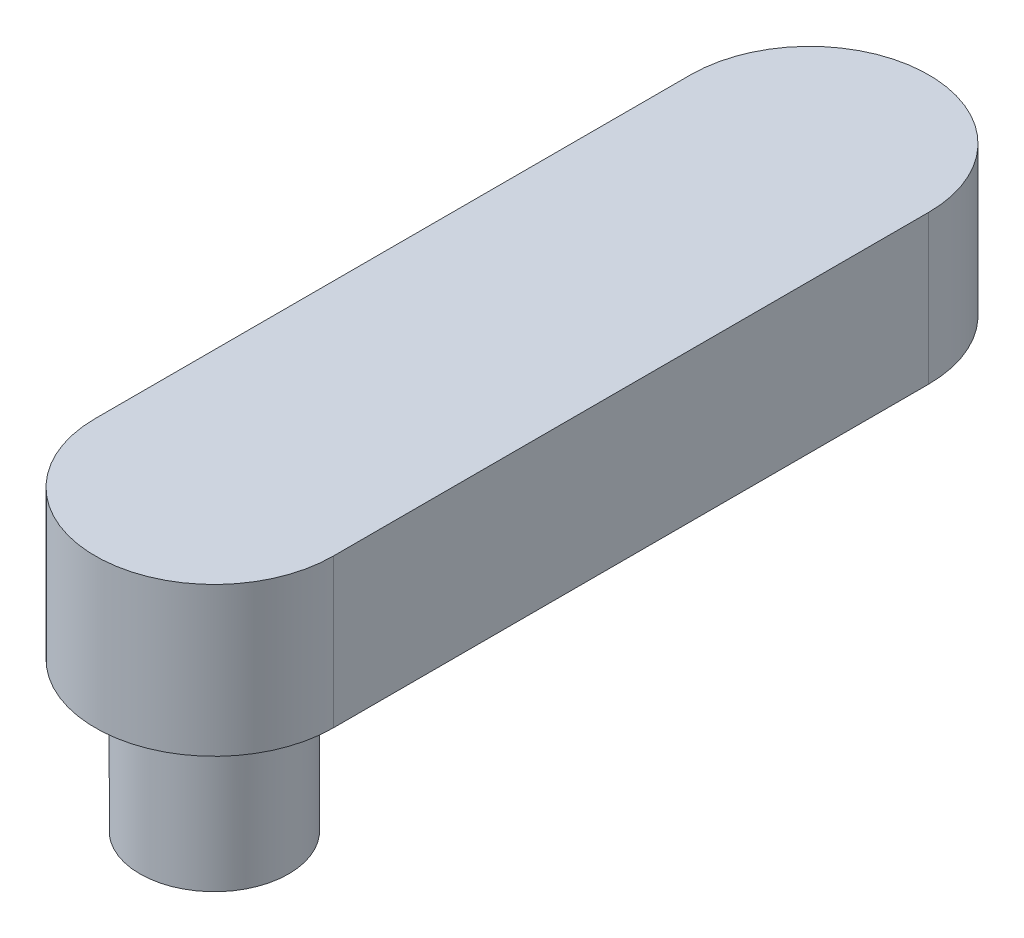
ISO-10303-21;
HEADER;
FILE_DESCRIPTION(('STEP AP214'),'2;1');
FILE_NAME('part.step','',(''),(''),'','','');
FILE_SCHEMA(('AUTOMOTIVE_DESIGN { 1 0 10303 214 1 1 1 1 }'));
ENDSEC;
DATA;
#1=APPLICATION_CONTEXT('core data for automotive mechanical design processes');
#2=APPLICATION_PROTOCOL_DEFINITION('international standard','automotive_design',2000,#1);
#3=PRODUCT_CONTEXT('',#1,'mechanical');
#4=PRODUCT('Part','Part','',(#3));
#5=PRODUCT_RELATED_PRODUCT_CATEGORY('part','',(#4));
#6=PRODUCT_DEFINITION_FORMATION('','',#4);
#7=PRODUCT_DEFINITION_CONTEXT('part definition',#1,'design');
#8=PRODUCT_DEFINITION('design','',#6,#7);
#9=PRODUCT_DEFINITION_SHAPE('','',#8);
#10=(LENGTH_UNIT() NAMED_UNIT(*) SI_UNIT(.MILLI.,.METRE.));
#11=(NAMED_UNIT(*) PLANE_ANGLE_UNIT() SI_UNIT($,.RADIAN.));
#12=(NAMED_UNIT(*) SI_UNIT($,.STERADIAN.) SOLID_ANGLE_UNIT());
#13=UNCERTAINTY_MEASURE_WITH_UNIT(LENGTH_MEASURE(1.E-05),#10,'distance_accuracy_value','');
#14=(GEOMETRIC_REPRESENTATION_CONTEXT(3) GLOBAL_UNCERTAINTY_ASSIGNED_CONTEXT((#13)) GLOBAL_UNIT_ASSIGNED_CONTEXT((#10,
#11,#12)) REPRESENTATION_CONTEXT('',''));
#15=CARTESIAN_POINT('',(0.,0.,0.));
#16=DIRECTION('',(0.,0.,1.));
#17=DIRECTION('',(1.,0.,0.));
#18=AXIS2_PLACEMENT_3D('',#15,#16,#17);
#19=CARTESIAN_POINT('',(0.,10.,-20.));
#20=DIRECTION('',(0.,-1.,0.));
#21=DIRECTION('',(0.,0.,-1.));
#22=AXIS2_PLACEMENT_3D('',#19,#20,#21);
#23=CYLINDRICAL_SURFACE('',#22,7.99999999999999);
#24=CARTESIAN_POINT('',(0.,0.,-20.));
#25=DIRECTION('',(0.,1.,0.));
#26=DIRECTION('',(0.,0.,1.));
#27=AXIS2_PLACEMENT_3D('',#24,#25,#26);
#28=CIRCLE('',#27,7.99999999999999);
#29=CARTESIAN_POINT('',(7.99999999999999,0.,-20.));
#30=VERTEX_POINT('',#29);
#31=CARTESIAN_POINT('',(-8.,0.,-20.));
#32=VERTEX_POINT('',#31);
#33=EDGE_CURVE('E99',#30,#32,#28,.T.);
#34=ORIENTED_EDGE('',*,*,#33,.T.);
#35=DIRECTION('',(0.,-1.,0.));
#36=VECTOR('',#35,1.);
#37=CARTESIAN_POINT('',(-8.,10.,-20.));
#38=LINE('',#37,#36);
#39=CARTESIAN_POINT('',(-8.,10.,-20.));
#40=VERTEX_POINT('',#39);
#41=EDGE_CURVE('E41',#40,#32,#38,.T.);
#42=ORIENTED_EDGE('',*,*,#41,.F.);
#43=CARTESIAN_POINT('',(0.,10.,-20.));
#44=DIRECTION('',(0.,1.,0.));
#45=DIRECTION('',(0.,0.,1.));
#46=AXIS2_PLACEMENT_3D('',#43,#44,#45);
#47=CIRCLE('',#46,7.99999999999999);
#48=CARTESIAN_POINT('',(7.99999999999999,10.,-20.));
#49=VERTEX_POINT('',#48);
#50=EDGE_CURVE('E85',#49,#40,#47,.T.);
#51=ORIENTED_EDGE('',*,*,#50,.F.);
#52=DIRECTION('',(0.,-1.,0.));
#53=VECTOR('',#52,1.);
#54=CARTESIAN_POINT('',(7.99999999999999,10.,-20.));
#55=LINE('',#54,#53);
#56=EDGE_CURVE('E95',#49,#30,#55,.T.);
#57=ORIENTED_EDGE('',*,*,#56,.T.);
#58=EDGE_LOOP('',(#34,#42,#51,#57));
#59=FACE_BOUND('',#58,.T.);
#60=ADVANCED_FACE('F33',(#59),#23,.T.);
#61=CARTESIAN_POINT('',(-8.,10.,-20.));
#62=DIRECTION('',(1.,0.,0.));
#63=DIRECTION('',(0.,0.,-1.));
#64=AXIS2_PLACEMENT_3D('',#61,#62,#63);
#65=PLANE('',#64);
#66=DIRECTION('',(0.,0.,1.));
#67=VECTOR('',#66,1.);
#68=CARTESIAN_POINT('',(-8.,0.,-20.));
#69=LINE('',#68,#67);
#70=CARTESIAN_POINT('',(-7.99999999999999,0.,20.));
#71=VERTEX_POINT('',#70);
#72=EDGE_CURVE('E90',#32,#71,#69,.T.);
#73=ORIENTED_EDGE('',*,*,#72,.T.);
#74=DIRECTION('',(0.,-1.,0.));
#75=VECTOR('',#74,1.);
#76=CARTESIAN_POINT('',(-7.99999999999999,10.,20.));
#77=LINE('',#76,#75);
#78=CARTESIAN_POINT('',(-7.99999999999999,10.,20.));
#79=VERTEX_POINT('',#78);
#80=EDGE_CURVE('E88',#79,#71,#77,.T.);
#81=ORIENTED_EDGE('',*,*,#80,.F.);
#82=DIRECTION('',(0.,0.,1.));
#83=VECTOR('',#82,1.);
#84=CARTESIAN_POINT('',(-8.,10.,-20.));
#85=LINE('',#84,#83);
#86=EDGE_CURVE('E80',#40,#79,#85,.T.);
#87=ORIENTED_EDGE('',*,*,#86,.F.);
#88=ORIENTED_EDGE('',*,*,#41,.T.);
#89=EDGE_LOOP('',(#73,#81,#87,#88));
#90=FACE_BOUND('',#89,.T.);
#91=ADVANCED_FACE('F89',(#90),#65,.F.);
#92=CARTESIAN_POINT('',(0.,10.,20.));
#93=DIRECTION('',(0.,-1.,0.));
#94=DIRECTION('',(0.,0.,-1.));
#95=AXIS2_PLACEMENT_3D('',#92,#93,#94);
#96=CYLINDRICAL_SURFACE('',#95,7.99999999999999);
#97=CARTESIAN_POINT('',(0.,0.,20.));
#98=DIRECTION('',(0.,1.,0.));
#99=DIRECTION('',(0.,0.,1.));
#100=AXIS2_PLACEMENT_3D('',#97,#98,#99);
#101=CIRCLE('',#100,7.99999999999999);
#102=CARTESIAN_POINT('',(8.,0.,20.));
#103=VERTEX_POINT('',#102);
#104=EDGE_CURVE('E66',#71,#103,#101,.T.);
#105=ORIENTED_EDGE('',*,*,#104,.T.);
#106=DIRECTION('',(0.,-1.,0.));
#107=VECTOR('',#106,1.);
#108=CARTESIAN_POINT('',(8.,10.,20.));
#109=LINE('',#108,#107);
#110=CARTESIAN_POINT('',(8.,10.,20.));
#111=VERTEX_POINT('',#110);
#112=EDGE_CURVE('E91',#111,#103,#109,.T.);
#113=ORIENTED_EDGE('',*,*,#112,.F.);
#114=CARTESIAN_POINT('',(0.,10.,20.));
#115=DIRECTION('',(0.,1.,0.));
#116=DIRECTION('',(0.,0.,1.));
#117=AXIS2_PLACEMENT_3D('',#114,#115,#116);
#118=CIRCLE('',#117,7.99999999999999);
#119=EDGE_CURVE('E83',#79,#111,#118,.T.);
#120=ORIENTED_EDGE('',*,*,#119,.F.);
#121=ORIENTED_EDGE('',*,*,#80,.T.);
#122=EDGE_LOOP('',(#105,#113,#120,#121));
#123=FACE_BOUND('',#122,.T.);
#124=ADVANCED_FACE('F93',(#123),#96,.T.);
#125=CARTESIAN_POINT('',(7.99999999999999,10.,-20.));
#126=DIRECTION('',(-1.,0.,0.));
#127=DIRECTION('',(0.,0.,1.));
#128=AXIS2_PLACEMENT_3D('',#125,#126,#127);
#129=PLANE('',#128);
#130=DIRECTION('',(0.,0.,-1.));
#131=VECTOR('',#130,1.);
#132=CARTESIAN_POINT('',(7.99999999999999,0.,-20.));
#133=LINE('',#132,#131);
#134=EDGE_CURVE('E72',#103,#30,#133,.T.);
#135=ORIENTED_EDGE('',*,*,#134,.T.);
#136=ORIENTED_EDGE('',*,*,#56,.F.);
#137=DIRECTION('',(0.,0.,-1.));
#138=VECTOR('',#137,1.);
#139=CARTESIAN_POINT('',(7.99999999999999,10.,-20.));
#140=LINE('',#139,#138);
#141=EDGE_CURVE('E49',#111,#49,#140,.T.);
#142=ORIENTED_EDGE('',*,*,#141,.F.);
#143=ORIENTED_EDGE('',*,*,#112,.T.);
#144=EDGE_LOOP('',(#135,#136,#142,#143));
#145=FACE_BOUND('',#144,.T.);
#146=ADVANCED_FACE('F122',(#145),#129,.F.);
#147=CARTESIAN_POINT('',(0.,10.,-20.));
#148=DIRECTION('',(0.,1.,0.));
#149=DIRECTION('',(0.,0.,1.));
#150=AXIS2_PLACEMENT_3D('',#147,#148,#149);
#151=PLANE('',#150);
#152=ORIENTED_EDGE('',*,*,#50,.T.);
#153=ORIENTED_EDGE('',*,*,#86,.T.);
#154=ORIENTED_EDGE('',*,*,#119,.T.);
#155=ORIENTED_EDGE('',*,*,#141,.T.);
#156=EDGE_LOOP('',(#152,#153,#154,#155));
#157=FACE_BOUND('',#156,.T.);
#158=ADVANCED_FACE('F81',(#157),#151,.T.);
#159=CARTESIAN_POINT('',(0.,0.,-20.));
#160=DIRECTION('',(0.,1.,0.));
#161=DIRECTION('',(0.,0.,1.));
#162=AXIS2_PLACEMENT_3D('',#159,#160,#161);
#163=PLANE('',#162);
#164=CARTESIAN_POINT('',(0.,0.,20.));
#165=DIRECTION('',(0.,1.,0.));
#166=DIRECTION('',(0.,0.,1.));
#167=AXIS2_PLACEMENT_3D('',#164,#165,#166);
#168=CIRCLE('',#167,5.);
#169=CARTESIAN_POINT('',(0.,0.,25.));
#170=VERTEX_POINT('',#169);
#171=EDGE_CURVE('E11',#170,#170,#168,.F.);
#172=ORIENTED_EDGE('',*,*,#171,.F.);
#173=EDGE_LOOP('',(#172));
#174=FACE_BOUND('',#173,.T.);
#175=ORIENTED_EDGE('',*,*,#33,.F.);
#176=ORIENTED_EDGE('',*,*,#134,.F.);
#177=ORIENTED_EDGE('',*,*,#104,.F.);
#178=ORIENTED_EDGE('',*,*,#72,.F.);
#179=EDGE_LOOP('',(#175,#176,#177,#178));
#180=FACE_BOUND('',#179,.T.);
#181=ADVANCED_FACE('F110',(#174,#180),#163,.F.);
#182=CARTESIAN_POINT('',(0.,-10.,20.));
#183=DIRECTION('',(0.,1.,0.));
#184=DIRECTION('',(0.,0.,1.));
#185=AXIS2_PLACEMENT_3D('',#182,#183,#184);
#186=CYLINDRICAL_SURFACE('',#185,5.);
#187=CARTESIAN_POINT('',(0.,-10.,20.));
#188=DIRECTION('',(0.,-1.,0.));
#189=DIRECTION('',(0.,0.,-1.));
#190=AXIS2_PLACEMENT_3D('',#187,#188,#189);
#191=CIRCLE('',#190,5.);
#192=CARTESIAN_POINT('',(0.,-10.,15.));
#193=VERTEX_POINT('',#192);
#194=EDGE_CURVE('E102',#193,#193,#191,.T.);
#195=ORIENTED_EDGE('',*,*,#194,.F.);
#196=EDGE_LOOP('',(#195));
#197=FACE_BOUND('',#196,.T.);
#198=ORIENTED_EDGE('',*,*,#171,.T.);
#199=EDGE_LOOP('',(#198));
#200=FACE_BOUND('',#199,.T.);
#201=ADVANCED_FACE('F112',(#197,#200),#186,.T.);
#202=CARTESIAN_POINT('',(0.,-10.,20.));
#203=DIRECTION('',(0.,-1.,0.));
#204=DIRECTION('',(0.,0.,-1.));
#205=AXIS2_PLACEMENT_3D('',#202,#203,#204);
#206=PLANE('',#205);
#207=ORIENTED_EDGE('',*,*,#194,.T.);
#208=EDGE_LOOP('',(#207));
#209=FACE_BOUND('',#208,.T.);
#210=ADVANCED_FACE('F119',(#209),#206,.T.);
#211=CLOSED_SHELL('',(#60,#91,#124,#146,#158,#181,#201,#210));
#212=MANIFOLD_SOLID_BREP('B2',#211);
#213=ADVANCED_BREP_SHAPE_REPRESENTATION('',(#18,#212),#14);
#214=SHAPE_DEFINITION_REPRESENTATION(#9,#213);
ENDSEC;
END-ISO-10303-21;
